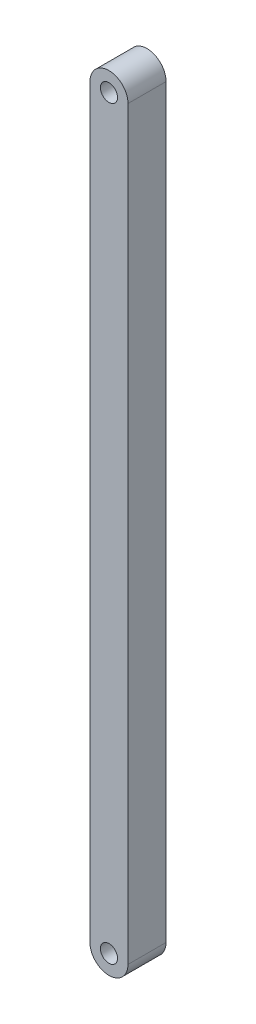
ISO-10303-21;
HEADER;
FILE_DESCRIPTION(('STEP AP214'),'2;1');
FILE_NAME('part.step','',(''),(''),'','','');
FILE_SCHEMA(('AUTOMOTIVE_DESIGN { 1 0 10303 214 1 1 1 1 }'));
ENDSEC;
DATA;
#1=APPLICATION_CONTEXT('core data for automotive mechanical design processes');
#2=APPLICATION_PROTOCOL_DEFINITION('international standard','automotive_design',2000,#1);
#3=PRODUCT_CONTEXT('',#1,'mechanical');
#4=PRODUCT('Part','Part','',(#3));
#5=PRODUCT_RELATED_PRODUCT_CATEGORY('part','',(#4));
#6=PRODUCT_DEFINITION_FORMATION('','',#4);
#7=PRODUCT_DEFINITION_CONTEXT('part definition',#1,'design');
#8=PRODUCT_DEFINITION('design','',#6,#7);
#9=PRODUCT_DEFINITION_SHAPE('','',#8);
#10=(LENGTH_UNIT() NAMED_UNIT(*) SI_UNIT(.MILLI.,.METRE.));
#11=(NAMED_UNIT(*) PLANE_ANGLE_UNIT() SI_UNIT($,.RADIAN.));
#12=(NAMED_UNIT(*) SI_UNIT($,.STERADIAN.) SOLID_ANGLE_UNIT());
#13=UNCERTAINTY_MEASURE_WITH_UNIT(LENGTH_MEASURE(1.E-05),#10,'distance_accuracy_value','');
#14=(GEOMETRIC_REPRESENTATION_CONTEXT(3) GLOBAL_UNCERTAINTY_ASSIGNED_CONTEXT((#13)) GLOBAL_UNIT_ASSIGNED_CONTEXT((#10,
#11,#12)) REPRESENTATION_CONTEXT('',''));
#15=CARTESIAN_POINT('',(0.,0.,0.));
#16=DIRECTION('',(0.,0.,1.));
#17=DIRECTION('',(1.,0.,0.));
#18=AXIS2_PLACEMENT_3D('',#15,#16,#17);
#19=CARTESIAN_POINT('',(0.,195.85,10.));
#20=DIRECTION('',(0.,0.,1.));
#21=DIRECTION('',(1.,0.,0.));
#22=AXIS2_PLACEMENT_3D('',#19,#20,#21);
#23=PLANE('',#22);
#24=CARTESIAN_POINT('',(0.,0.,10.));
#25=DIRECTION('',(0.,0.,1.));
#26=DIRECTION('',(1.,0.,0.));
#27=AXIS2_PLACEMENT_3D('',#24,#25,#26);
#28=CIRCLE('',#27,2.25);
#29=CARTESIAN_POINT('',(2.25,0.,10.));
#30=VERTEX_POINT('',#29);
#31=EDGE_CURVE('E112',#30,#30,#28,.T.);
#32=ORIENTED_EDGE('',*,*,#31,.F.);
#33=EDGE_LOOP('',(#32));
#34=FACE_BOUND('',#33,.T.);
#35=CARTESIAN_POINT('',(0.,195.85,10.));
#36=DIRECTION('',(0.,0.,1.));
#37=DIRECTION('',(1.,0.,0.));
#38=AXIS2_PLACEMENT_3D('',#35,#36,#37);
#39=CIRCLE('',#38,5.);
#40=CARTESIAN_POINT('',(5.,195.85,10.));
#41=VERTEX_POINT('',#40);
#42=CARTESIAN_POINT('',(-5.,195.85,10.));
#43=VERTEX_POINT('',#42);
#44=EDGE_CURVE('E92',#41,#43,#39,.T.);
#45=ORIENTED_EDGE('',*,*,#44,.T.);
#46=DIRECTION('',(0.,-1.,0.));
#47=VECTOR('',#46,1.);
#48=CARTESIAN_POINT('',(-5.,195.85,10.));
#49=LINE('',#48,#47);
#50=CARTESIAN_POINT('',(-5.,0.,10.));
#51=VERTEX_POINT('',#50);
#52=EDGE_CURVE('E87',#43,#51,#49,.T.);
#53=ORIENTED_EDGE('',*,*,#52,.T.);
#54=CARTESIAN_POINT('',(0.,0.,10.));
#55=DIRECTION('',(0.,0.,1.));
#56=DIRECTION('',(1.,0.,0.));
#57=AXIS2_PLACEMENT_3D('',#54,#55,#56);
#58=CIRCLE('',#57,5.);
#59=CARTESIAN_POINT('',(5.00000000000002,0.,10.));
#60=VERTEX_POINT('',#59);
#61=EDGE_CURVE('E90',#51,#60,#58,.T.);
#62=ORIENTED_EDGE('',*,*,#61,.T.);
#63=DIRECTION('',(0.,1.,0.));
#64=VECTOR('',#63,1.);
#65=CARTESIAN_POINT('',(5.,195.85,10.));
#66=LINE('',#65,#64);
#67=EDGE_CURVE('E57',#60,#41,#66,.T.);
#68=ORIENTED_EDGE('',*,*,#67,.T.);
#69=EDGE_LOOP('',(#45,#53,#62,#68));
#70=FACE_BOUND('',#69,.T.);
#71=CARTESIAN_POINT('',(0.,195.85,10.));
#72=DIRECTION('',(0.,0.,1.));
#73=DIRECTION('',(1.,0.,0.));
#74=AXIS2_PLACEMENT_3D('',#71,#72,#73);
#75=CIRCLE('',#74,2.25);
#76=CARTESIAN_POINT('',(2.25,195.85,10.));
#77=VERTEX_POINT('',#76);
#78=EDGE_CURVE('E134',#77,#77,#75,.T.);
#79=ORIENTED_EDGE('',*,*,#78,.F.);
#80=EDGE_LOOP('',(#79));
#81=FACE_BOUND('',#80,.T.);
#82=ADVANCED_FACE('F39',(#34,#70,#81),#23,.T.);
#83=CARTESIAN_POINT('',(0.,195.85,0.));
#84=DIRECTION('',(0.,0.,1.));
#85=DIRECTION('',(1.,0.,0.));
#86=AXIS2_PLACEMENT_3D('',#83,#84,#85);
#87=PLANE('',#86);
#88=CARTESIAN_POINT('',(0.,195.85,0.));
#89=DIRECTION('',(0.,0.,1.));
#90=DIRECTION('',(1.,0.,0.));
#91=AXIS2_PLACEMENT_3D('',#88,#89,#90);
#92=CIRCLE('',#91,5.);
#93=CARTESIAN_POINT('',(5.,195.85,0.));
#94=VERTEX_POINT('',#93);
#95=CARTESIAN_POINT('',(-5.,195.85,0.));
#96=VERTEX_POINT('',#95);
#97=EDGE_CURVE('E108',#94,#96,#92,.T.);
#98=ORIENTED_EDGE('',*,*,#97,.F.);
#99=DIRECTION('',(0.,1.,0.));
#100=VECTOR('',#99,1.);
#101=CARTESIAN_POINT('',(5.,195.85,0.));
#102=LINE('',#101,#100);
#103=CARTESIAN_POINT('',(5.00000000000002,0.,0.));
#104=VERTEX_POINT('',#103);
#105=EDGE_CURVE('E80',#104,#94,#102,.T.);
#106=ORIENTED_EDGE('',*,*,#105,.F.);
#107=CARTESIAN_POINT('',(0.,0.,0.));
#108=DIRECTION('',(0.,0.,1.));
#109=DIRECTION('',(1.,0.,0.));
#110=AXIS2_PLACEMENT_3D('',#107,#108,#109);
#111=CIRCLE('',#110,5.);
#112=CARTESIAN_POINT('',(-5.,0.,0.));
#113=VERTEX_POINT('',#112);
#114=EDGE_CURVE('E74',#113,#104,#111,.T.);
#115=ORIENTED_EDGE('',*,*,#114,.F.);
#116=DIRECTION('',(0.,-1.,0.));
#117=VECTOR('',#116,1.);
#118=CARTESIAN_POINT('',(-5.,195.85,0.));
#119=LINE('',#118,#117);
#120=EDGE_CURVE('E97',#96,#113,#119,.T.);
#121=ORIENTED_EDGE('',*,*,#120,.F.);
#122=EDGE_LOOP('',(#98,#106,#115,#121));
#123=FACE_BOUND('',#122,.T.);
#124=CARTESIAN_POINT('',(0.,0.,0.));
#125=DIRECTION('',(0.,0.,1.));
#126=DIRECTION('',(1.,0.,0.));
#127=AXIS2_PLACEMENT_3D('',#124,#125,#126);
#128=CIRCLE('',#127,2.25);
#129=CARTESIAN_POINT('',(2.25,0.,0.));
#130=VERTEX_POINT('',#129);
#131=EDGE_CURVE('E130',#130,#130,#128,.T.);
#132=ORIENTED_EDGE('',*,*,#131,.T.);
#133=EDGE_LOOP('',(#132));
#134=FACE_BOUND('',#133,.T.);
#135=CARTESIAN_POINT('',(0.,195.85,0.));
#136=DIRECTION('',(0.,0.,1.));
#137=DIRECTION('',(1.,0.,0.));
#138=AXIS2_PLACEMENT_3D('',#135,#136,#137);
#139=CIRCLE('',#138,2.25);
#140=CARTESIAN_POINT('',(2.25,195.85,0.));
#141=VERTEX_POINT('',#140);
#142=EDGE_CURVE('E138',#141,#141,#139,.T.);
#143=ORIENTED_EDGE('',*,*,#142,.T.);
#144=EDGE_LOOP('',(#143));
#145=FACE_BOUND('',#144,.T.);
#146=ADVANCED_FACE('F125',(#123,#134,#145),#87,.F.);
#147=CARTESIAN_POINT('',(0.,195.85,10.));
#148=DIRECTION('',(0.,0.,-1.));
#149=DIRECTION('',(-1.,0.,0.));
#150=AXIS2_PLACEMENT_3D('',#147,#148,#149);
#151=CYLINDRICAL_SURFACE('',#150,5.);
#152=ORIENTED_EDGE('',*,*,#97,.T.);
#153=DIRECTION('',(0.,0.,-1.));
#154=VECTOR('',#153,1.);
#155=CARTESIAN_POINT('',(-5.,195.85,10.));
#156=LINE('',#155,#154);
#157=EDGE_CURVE('E11',#43,#96,#156,.T.);
#158=ORIENTED_EDGE('',*,*,#157,.F.);
#159=ORIENTED_EDGE('',*,*,#44,.F.);
#160=DIRECTION('',(0.,0.,-1.));
#161=VECTOR('',#160,1.);
#162=CARTESIAN_POINT('',(5.,195.85,10.));
#163=LINE('',#162,#161);
#164=EDGE_CURVE('E104',#41,#94,#163,.T.);
#165=ORIENTED_EDGE('',*,*,#164,.T.);
#166=EDGE_LOOP('',(#152,#158,#159,#165));
#167=FACE_BOUND('',#166,.T.);
#168=ADVANCED_FACE('F41',(#167),#151,.T.);
#169=CARTESIAN_POINT('',(-5.,195.85,10.));
#170=DIRECTION('',(1.,0.,0.));
#171=DIRECTION('',(0.,1.,0.));
#172=AXIS2_PLACEMENT_3D('',#169,#170,#171);
#173=PLANE('',#172);
#174=ORIENTED_EDGE('',*,*,#120,.T.);
#175=DIRECTION('',(0.,0.,-1.));
#176=VECTOR('',#175,1.);
#177=CARTESIAN_POINT('',(-5.,0.,10.));
#178=LINE('',#177,#176);
#179=EDGE_CURVE('E49',#51,#113,#178,.T.);
#180=ORIENTED_EDGE('',*,*,#179,.F.);
#181=ORIENTED_EDGE('',*,*,#52,.F.);
#182=ORIENTED_EDGE('',*,*,#157,.T.);
#183=EDGE_LOOP('',(#174,#180,#181,#182));
#184=FACE_BOUND('',#183,.T.);
#185=ADVANCED_FACE('F96',(#184),#173,.F.);
#186=CARTESIAN_POINT('',(0.,0.,10.));
#187=DIRECTION('',(0.,0.,-1.));
#188=DIRECTION('',(-1.,0.,0.));
#189=AXIS2_PLACEMENT_3D('',#186,#187,#188);
#190=CYLINDRICAL_SURFACE('',#189,5.);
#191=ORIENTED_EDGE('',*,*,#114,.T.);
#192=DIRECTION('',(0.,0.,-1.));
#193=VECTOR('',#192,1.);
#194=CARTESIAN_POINT('',(5.00000000000002,0.,10.));
#195=LINE('',#194,#193);
#196=EDGE_CURVE('E99',#60,#104,#195,.T.);
#197=ORIENTED_EDGE('',*,*,#196,.F.);
#198=ORIENTED_EDGE('',*,*,#61,.F.);
#199=ORIENTED_EDGE('',*,*,#179,.T.);
#200=EDGE_LOOP('',(#191,#197,#198,#199));
#201=FACE_BOUND('',#200,.T.);
#202=ADVANCED_FACE('F100',(#201),#190,.T.);
#203=CARTESIAN_POINT('',(5.,195.85,10.));
#204=DIRECTION('',(-1.,0.,0.));
#205=DIRECTION('',(0.,-1.,0.));
#206=AXIS2_PLACEMENT_3D('',#203,#204,#205);
#207=PLANE('',#206);
#208=ORIENTED_EDGE('',*,*,#105,.T.);
#209=ORIENTED_EDGE('',*,*,#164,.F.);
#210=ORIENTED_EDGE('',*,*,#67,.F.);
#211=ORIENTED_EDGE('',*,*,#196,.T.);
#212=EDGE_LOOP('',(#208,#209,#210,#211));
#213=FACE_BOUND('',#212,.T.);
#214=ADVANCED_FACE('F122',(#213),#207,.F.);
#215=CARTESIAN_POINT('',(0.,0.,10.));
#216=DIRECTION('',(0.,0.,-1.));
#217=DIRECTION('',(-1.,0.,0.));
#218=AXIS2_PLACEMENT_3D('',#215,#216,#217);
#219=CYLINDRICAL_SURFACE('',#218,2.25);
#220=ORIENTED_EDGE('',*,*,#31,.T.);
#221=EDGE_LOOP('',(#220));
#222=FACE_BOUND('',#221,.T.);
#223=ORIENTED_EDGE('',*,*,#131,.F.);
#224=EDGE_LOOP('',(#223));
#225=FACE_BOUND('',#224,.T.);
#226=ADVANCED_FACE('F157',(#222,#225),#219,.F.);
#227=CARTESIAN_POINT('',(0.,195.85,10.));
#228=DIRECTION('',(0.,0.,-1.));
#229=DIRECTION('',(-1.,0.,0.));
#230=AXIS2_PLACEMENT_3D('',#227,#228,#229);
#231=CYLINDRICAL_SURFACE('',#230,2.25);
#232=ORIENTED_EDGE('',*,*,#78,.T.);
#233=EDGE_LOOP('',(#232));
#234=FACE_BOUND('',#233,.T.);
#235=ORIENTED_EDGE('',*,*,#142,.F.);
#236=EDGE_LOOP('',(#235));
#237=FACE_BOUND('',#236,.T.);
#238=ADVANCED_FACE('F146',(#234,#237),#231,.F.);
#239=CLOSED_SHELL('',(#82,#146,#168,#185,#202,#214,#226,#238));
#240=MANIFOLD_SOLID_BREP('B2',#239);
#241=ADVANCED_BREP_SHAPE_REPRESENTATION('',(#18,#240),#14);
#242=SHAPE_DEFINITION_REPRESENTATION(#9,#241);
ENDSEC;
END-ISO-10303-21;
